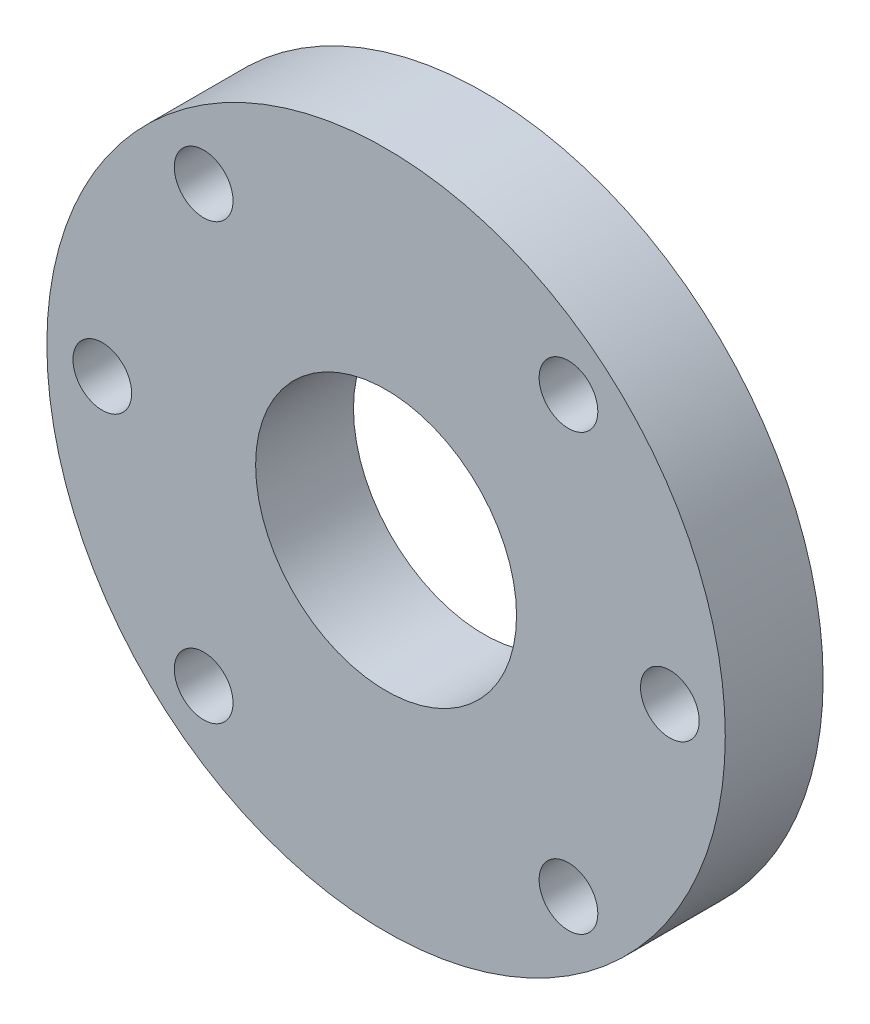
ISO-10303-21;
HEADER;
FILE_DESCRIPTION(('STEP AP214'),'2;1');
FILE_NAME('part.step','',(''),(''),'','','');
FILE_SCHEMA(('AUTOMOTIVE_DESIGN { 1 0 10303 214 1 1 1 1 }'));
ENDSEC;
DATA;
#1=APPLICATION_CONTEXT('core data for automotive mechanical design processes');
#2=APPLICATION_PROTOCOL_DEFINITION('international standard','automotive_design',2000,#1);
#3=PRODUCT_CONTEXT('',#1,'mechanical');
#4=PRODUCT('Part','Part','',(#3));
#5=PRODUCT_RELATED_PRODUCT_CATEGORY('part','',(#4));
#6=PRODUCT_DEFINITION_FORMATION('','',#4);
#7=PRODUCT_DEFINITION_CONTEXT('part definition',#1,'design');
#8=PRODUCT_DEFINITION('design','',#6,#7);
#9=PRODUCT_DEFINITION_SHAPE('','',#8);
#10=(LENGTH_UNIT() NAMED_UNIT(*) SI_UNIT(.MILLI.,.METRE.));
#11=(NAMED_UNIT(*) PLANE_ANGLE_UNIT() SI_UNIT($,.RADIAN.));
#12=(NAMED_UNIT(*) SI_UNIT($,.STERADIAN.) SOLID_ANGLE_UNIT());
#13=UNCERTAINTY_MEASURE_WITH_UNIT(LENGTH_MEASURE(1.E-05),#10,'distance_accuracy_value','');
#14=(GEOMETRIC_REPRESENTATION_CONTEXT(3) GLOBAL_UNCERTAINTY_ASSIGNED_CONTEXT((#13)) GLOBAL_UNIT_ASSIGNED_CONTEXT((#10,
#11,#12)) REPRESENTATION_CONTEXT('',''));
#15=CARTESIAN_POINT('',(0.,0.,0.));
#16=DIRECTION('',(0.,0.,1.));
#17=DIRECTION('',(1.,0.,0.));
#18=AXIS2_PLACEMENT_3D('',#15,#16,#17);
#19=CARTESIAN_POINT('',(0.,0.,7.5));
#20=DIRECTION('',(0.,0.,1.));
#21=DIRECTION('',(1.,0.,0.));
#22=AXIS2_PLACEMENT_3D('',#19,#20,#21);
#23=PLANE('',#22);
#24=CARTESIAN_POINT('',(0.,0.,7.5));
#25=DIRECTION('',(0.,0.,1.));
#26=DIRECTION('',(1.,0.,0.));
#27=AXIS2_PLACEMENT_3D('',#24,#25,#26);
#28=CIRCLE('',#27,10.);
#29=CARTESIAN_POINT('',(10.,0.,7.5));
#30=VERTEX_POINT('',#29);
#31=EDGE_CURVE('E105',#30,#30,#28,.T.);
#32=ORIENTED_EDGE('',*,*,#31,.F.);
#33=EDGE_LOOP('',(#32));
#34=FACE_BOUND('',#33,.T.);
#35=CARTESIAN_POINT('',(21.75,0.,7.5));
#36=DIRECTION('',(0.,0.,1.));
#37=DIRECTION('',(1.,0.,0.));
#38=AXIS2_PLACEMENT_3D('',#35,#36,#37);
#39=CIRCLE('',#38,2.25);
#40=CARTESIAN_POINT('',(24.,0.,7.5));
#41=VERTEX_POINT('',#40);
#42=EDGE_CURVE('E85',#41,#41,#39,.T.);
#43=ORIENTED_EDGE('',*,*,#42,.F.);
#44=EDGE_LOOP('',(#43));
#45=FACE_BOUND('',#44,.T.);
#46=CARTESIAN_POINT('',(-13.9806305106822,-16.6614666378378,7.5));
#47=DIRECTION('',(0.,0.,1.));
#48=DIRECTION('',(1.,0.,0.));
#49=AXIS2_PLACEMENT_3D('',#46,#47,#48);
#50=CIRCLE('',#49,2.25);
#51=CARTESIAN_POINT('',(-11.7306305106822,-16.6614666378378,7.5));
#52=VERTEX_POINT('',#51);
#53=EDGE_CURVE('E69',#52,#52,#50,.T.);
#54=ORIENTED_EDGE('',*,*,#53,.F.);
#55=EDGE_LOOP('',(#54));
#56=FACE_BOUND('',#55,.T.);
#57=CARTESIAN_POINT('',(-21.75,0.,7.5));
#58=DIRECTION('',(0.,0.,1.));
#59=DIRECTION('',(1.,0.,0.));
#60=AXIS2_PLACEMENT_3D('',#57,#58,#59);
#61=CIRCLE('',#60,2.25);
#62=CARTESIAN_POINT('',(-19.5,0.,7.5));
#63=VERTEX_POINT('',#62);
#64=EDGE_CURVE('E55',#63,#63,#61,.T.);
#65=ORIENTED_EDGE('',*,*,#64,.F.);
#66=EDGE_LOOP('',(#65));
#67=FACE_BOUND('',#66,.T.);
#68=CARTESIAN_POINT('',(0.,0.,7.5));
#69=DIRECTION('',(0.,0.,1.));
#70=DIRECTION('',(1.,0.,0.));
#71=AXIS2_PLACEMENT_3D('',#68,#69,#70);
#72=CIRCLE('',#71,26.);
#73=CARTESIAN_POINT('',(26.,0.,7.5));
#74=VERTEX_POINT('',#73);
#75=EDGE_CURVE('E10',#74,#74,#72,.T.);
#76=ORIENTED_EDGE('',*,*,#75,.T.);
#77=EDGE_LOOP('',(#76));
#78=FACE_BOUND('',#77,.T.);
#79=CARTESIAN_POINT('',(-13.9806305106822,16.6614666378378,7.5));
#80=DIRECTION('',(0.,0.,1.));
#81=DIRECTION('',(1.,0.,0.));
#82=AXIS2_PLACEMENT_3D('',#79,#80,#81);
#83=CIRCLE('',#82,2.25);
#84=CARTESIAN_POINT('',(-11.7306305106822,16.6614666378378,7.5));
#85=VERTEX_POINT('',#84);
#86=EDGE_CURVE('E61',#85,#85,#83,.T.);
#87=ORIENTED_EDGE('',*,*,#86,.F.);
#88=EDGE_LOOP('',(#87));
#89=FACE_BOUND('',#88,.T.);
#90=CARTESIAN_POINT('',(13.9806305106822,-16.6614666378378,7.5));
#91=DIRECTION('',(0.,0.,1.));
#92=DIRECTION('',(1.,0.,0.));
#93=AXIS2_PLACEMENT_3D('',#90,#91,#92);
#94=CIRCLE('',#93,2.25);
#95=CARTESIAN_POINT('',(16.2306305106822,-16.6614666378378,7.5));
#96=VERTEX_POINT('',#95);
#97=EDGE_CURVE('E77',#96,#96,#94,.T.);
#98=ORIENTED_EDGE('',*,*,#97,.F.);
#99=EDGE_LOOP('',(#98));
#100=FACE_BOUND('',#99,.T.);
#101=CARTESIAN_POINT('',(13.9806305106822,16.6614666378378,7.5));
#102=DIRECTION('',(0.,0.,1.));
#103=DIRECTION('',(1.,0.,0.));
#104=AXIS2_PLACEMENT_3D('',#101,#102,#103);
#105=CIRCLE('',#104,2.25);
#106=CARTESIAN_POINT('',(16.2306305106822,16.6614666378378,7.5));
#107=VERTEX_POINT('',#106);
#108=EDGE_CURVE('E93',#107,#107,#105,.T.);
#109=ORIENTED_EDGE('',*,*,#108,.F.);
#110=EDGE_LOOP('',(#109));
#111=FACE_BOUND('',#110,.T.);
#112=ADVANCED_FACE('F42',(#34,#45,#56,#67,#78,#89,#100,#111),#23,.T.);
#113=CARTESIAN_POINT('',(0.,0.,0.));
#114=DIRECTION('',(0.,0.,1.));
#115=DIRECTION('',(1.,0.,0.));
#116=AXIS2_PLACEMENT_3D('',#113,#114,#115);
#117=PLANE('',#116);
#118=CARTESIAN_POINT('',(0.,0.,0.));
#119=DIRECTION('',(0.,0.,1.));
#120=DIRECTION('',(1.,0.,0.));
#121=AXIS2_PLACEMENT_3D('',#118,#119,#120);
#122=CIRCLE('',#121,10.);
#123=CARTESIAN_POINT('',(10.,0.,0.));
#124=VERTEX_POINT('',#123);
#125=EDGE_CURVE('E101',#124,#124,#122,.T.);
#126=ORIENTED_EDGE('',*,*,#125,.T.);
#127=EDGE_LOOP('',(#126));
#128=FACE_BOUND('',#127,.T.);
#129=CARTESIAN_POINT('',(0.,0.,0.));
#130=DIRECTION('',(0.,0.,1.));
#131=DIRECTION('',(1.,0.,0.));
#132=AXIS2_PLACEMENT_3D('',#129,#130,#131);
#133=CIRCLE('',#132,26.);
#134=CARTESIAN_POINT('',(26.,0.,0.));
#135=VERTEX_POINT('',#134);
#136=EDGE_CURVE('E46',#135,#135,#133,.T.);
#137=ORIENTED_EDGE('',*,*,#136,.F.);
#138=EDGE_LOOP('',(#137));
#139=FACE_BOUND('',#138,.T.);
#140=CARTESIAN_POINT('',(-21.75,0.,0.));
#141=DIRECTION('',(0.,0.,1.));
#142=DIRECTION('',(1.,0.,0.));
#143=AXIS2_PLACEMENT_3D('',#140,#141,#142);
#144=CIRCLE('',#143,2.25);
#145=CARTESIAN_POINT('',(-19.5,0.,0.));
#146=VERTEX_POINT('',#145);
#147=EDGE_CURVE('E57',#146,#146,#144,.T.);
#148=ORIENTED_EDGE('',*,*,#147,.T.);
#149=EDGE_LOOP('',(#148));
#150=FACE_BOUND('',#149,.T.);
#151=CARTESIAN_POINT('',(-13.9806305106822,16.6614666378378,0.));
#152=DIRECTION('',(0.,0.,1.));
#153=DIRECTION('',(1.,0.,0.));
#154=AXIS2_PLACEMENT_3D('',#151,#152,#153);
#155=CIRCLE('',#154,2.25);
#156=CARTESIAN_POINT('',(-11.7306305106822,16.6614666378378,0.));
#157=VERTEX_POINT('',#156);
#158=EDGE_CURVE('E65',#157,#157,#155,.T.);
#159=ORIENTED_EDGE('',*,*,#158,.T.);
#160=EDGE_LOOP('',(#159));
#161=FACE_BOUND('',#160,.T.);
#162=CARTESIAN_POINT('',(-13.9806305106822,-16.6614666378378,0.));
#163=DIRECTION('',(0.,0.,1.));
#164=DIRECTION('',(1.,0.,0.));
#165=AXIS2_PLACEMENT_3D('',#162,#163,#164);
#166=CIRCLE('',#165,2.25);
#167=CARTESIAN_POINT('',(-11.7306305106822,-16.6614666378378,0.));
#168=VERTEX_POINT('',#167);
#169=EDGE_CURVE('E73',#168,#168,#166,.T.);
#170=ORIENTED_EDGE('',*,*,#169,.T.);
#171=EDGE_LOOP('',(#170));
#172=FACE_BOUND('',#171,.T.);
#173=CARTESIAN_POINT('',(13.9806305106822,-16.6614666378378,0.));
#174=DIRECTION('',(0.,0.,1.));
#175=DIRECTION('',(1.,0.,0.));
#176=AXIS2_PLACEMENT_3D('',#173,#174,#175);
#177=CIRCLE('',#176,2.25);
#178=CARTESIAN_POINT('',(16.2306305106822,-16.6614666378378,0.));
#179=VERTEX_POINT('',#178);
#180=EDGE_CURVE('E81',#179,#179,#177,.T.);
#181=ORIENTED_EDGE('',*,*,#180,.T.);
#182=EDGE_LOOP('',(#181));
#183=FACE_BOUND('',#182,.T.);
#184=CARTESIAN_POINT('',(21.75,0.,0.));
#185=DIRECTION('',(0.,0.,1.));
#186=DIRECTION('',(1.,0.,0.));
#187=AXIS2_PLACEMENT_3D('',#184,#185,#186);
#188=CIRCLE('',#187,2.25);
#189=CARTESIAN_POINT('',(24.,0.,0.));
#190=VERTEX_POINT('',#189);
#191=EDGE_CURVE('E89',#190,#190,#188,.T.);
#192=ORIENTED_EDGE('',*,*,#191,.T.);
#193=EDGE_LOOP('',(#192));
#194=FACE_BOUND('',#193,.T.);
#195=CARTESIAN_POINT('',(13.9806305106822,16.6614666378378,0.));
#196=DIRECTION('',(0.,0.,1.));
#197=DIRECTION('',(1.,0.,0.));
#198=AXIS2_PLACEMENT_3D('',#195,#196,#197);
#199=CIRCLE('',#198,2.25);
#200=CARTESIAN_POINT('',(16.2306305106822,16.6614666378378,0.));
#201=VERTEX_POINT('',#200);
#202=EDGE_CURVE('E97',#201,#201,#199,.T.);
#203=ORIENTED_EDGE('',*,*,#202,.T.);
#204=EDGE_LOOP('',(#203));
#205=FACE_BOUND('',#204,.T.);
#206=ADVANCED_FACE('F113',(#128,#139,#150,#161,#172,#183,#194,#205),#117,.F.);
#207=CARTESIAN_POINT('',(0.,0.,7.5));
#208=DIRECTION('',(0.,0.,-1.));
#209=DIRECTION('',(-1.,0.,0.));
#210=AXIS2_PLACEMENT_3D('',#207,#208,#209);
#211=CYLINDRICAL_SURFACE('',#210,26.);
#212=ORIENTED_EDGE('',*,*,#75,.F.);
#213=EDGE_LOOP('',(#212));
#214=FACE_BOUND('',#213,.T.);
#215=ORIENTED_EDGE('',*,*,#136,.T.);
#216=EDGE_LOOP('',(#215));
#217=FACE_BOUND('',#216,.T.);
#218=ADVANCED_FACE('F44',(#214,#217),#211,.T.);
#219=CARTESIAN_POINT('',(-21.75,0.,7.5));
#220=DIRECTION('',(0.,0.,-1.));
#221=DIRECTION('',(-1.,0.,0.));
#222=AXIS2_PLACEMENT_3D('',#219,#220,#221);
#223=CYLINDRICAL_SURFACE('',#222,2.25);
#224=ORIENTED_EDGE('',*,*,#64,.T.);
#225=EDGE_LOOP('',(#224));
#226=FACE_BOUND('',#225,.T.);
#227=ORIENTED_EDGE('',*,*,#147,.F.);
#228=EDGE_LOOP('',(#227));
#229=FACE_BOUND('',#228,.T.);
#230=ADVANCED_FACE('F148',(#226,#229),#223,.F.);
#231=CARTESIAN_POINT('',(-13.9806305106822,16.6614666378378,7.5));
#232=DIRECTION('',(0.,0.,-1.));
#233=DIRECTION('',(-1.,0.,0.));
#234=AXIS2_PLACEMENT_3D('',#231,#232,#233);
#235=CYLINDRICAL_SURFACE('',#234,2.25);
#236=ORIENTED_EDGE('',*,*,#86,.T.);
#237=EDGE_LOOP('',(#236));
#238=FACE_BOUND('',#237,.T.);
#239=ORIENTED_EDGE('',*,*,#158,.F.);
#240=EDGE_LOOP('',(#239));
#241=FACE_BOUND('',#240,.T.);
#242=ADVANCED_FACE('F153',(#238,#241),#235,.F.);
#243=CARTESIAN_POINT('',(-13.9806305106822,-16.6614666378378,7.5));
#244=DIRECTION('',(0.,0.,-1.));
#245=DIRECTION('',(-1.,0.,0.));
#246=AXIS2_PLACEMENT_3D('',#243,#244,#245);
#247=CYLINDRICAL_SURFACE('',#246,2.25);
#248=ORIENTED_EDGE('',*,*,#53,.T.);
#249=EDGE_LOOP('',(#248));
#250=FACE_BOUND('',#249,.T.);
#251=ORIENTED_EDGE('',*,*,#169,.F.);
#252=EDGE_LOOP('',(#251));
#253=FACE_BOUND('',#252,.T.);
#254=ADVANCED_FACE('F157',(#250,#253),#247,.F.);
#255=CARTESIAN_POINT('',(13.9806305106822,-16.6614666378378,7.5));
#256=DIRECTION('',(0.,0.,-1.));
#257=DIRECTION('',(-1.,0.,0.));
#258=AXIS2_PLACEMENT_3D('',#255,#256,#257);
#259=CYLINDRICAL_SURFACE('',#258,2.25);
#260=ORIENTED_EDGE('',*,*,#97,.T.);
#261=EDGE_LOOP('',(#260));
#262=FACE_BOUND('',#261,.T.);
#263=ORIENTED_EDGE('',*,*,#180,.F.);
#264=EDGE_LOOP('',(#263));
#265=FACE_BOUND('',#264,.T.);
#266=ADVANCED_FACE('F161',(#262,#265),#259,.F.);
#267=CARTESIAN_POINT('',(21.75,0.,7.5));
#268=DIRECTION('',(0.,0.,-1.));
#269=DIRECTION('',(-1.,0.,0.));
#270=AXIS2_PLACEMENT_3D('',#267,#268,#269);
#271=CYLINDRICAL_SURFACE('',#270,2.25);
#272=ORIENTED_EDGE('',*,*,#42,.T.);
#273=EDGE_LOOP('',(#272));
#274=FACE_BOUND('',#273,.T.);
#275=ORIENTED_EDGE('',*,*,#191,.F.);
#276=EDGE_LOOP('',(#275));
#277=FACE_BOUND('',#276,.T.);
#278=ADVANCED_FACE('F140',(#274,#277),#271,.F.);
#279=CARTESIAN_POINT('',(13.9806305106822,16.6614666378378,7.5));
#280=DIRECTION('',(0.,0.,-1.));
#281=DIRECTION('',(-1.,0.,0.));
#282=AXIS2_PLACEMENT_3D('',#279,#280,#281);
#283=CYLINDRICAL_SURFACE('',#282,2.25);
#284=ORIENTED_EDGE('',*,*,#108,.T.);
#285=EDGE_LOOP('',(#284));
#286=FACE_BOUND('',#285,.T.);
#287=ORIENTED_EDGE('',*,*,#202,.F.);
#288=EDGE_LOOP('',(#287));
#289=FACE_BOUND('',#288,.T.);
#290=ADVANCED_FACE('F119',(#286,#289),#283,.F.);
#291=CARTESIAN_POINT('',(0.,0.,0.));
#292=DIRECTION('',(0.,0.,1.));
#293=DIRECTION('',(1.,0.,0.));
#294=AXIS2_PLACEMENT_3D('',#291,#292,#293);
#295=CYLINDRICAL_SURFACE('',#294,10.);
#296=ORIENTED_EDGE('',*,*,#125,.F.);
#297=EDGE_LOOP('',(#296));
#298=FACE_BOUND('',#297,.T.);
#299=ORIENTED_EDGE('',*,*,#31,.T.);
#300=EDGE_LOOP('',(#299));
#301=FACE_BOUND('',#300,.T.);
#302=ADVANCED_FACE('F116',(#298,#301),#295,.F.);
#303=CLOSED_SHELL('',(#112,#206,#218,#230,#242,#254,#266,#278,#290,#302));
#304=MANIFOLD_SOLID_BREP('B2',#303);
#305=ADVANCED_BREP_SHAPE_REPRESENTATION('',(#18,#304),#14);
#306=SHAPE_DEFINITION_REPRESENTATION(#9,#305);
ENDSEC;
END-ISO-10303-21;
